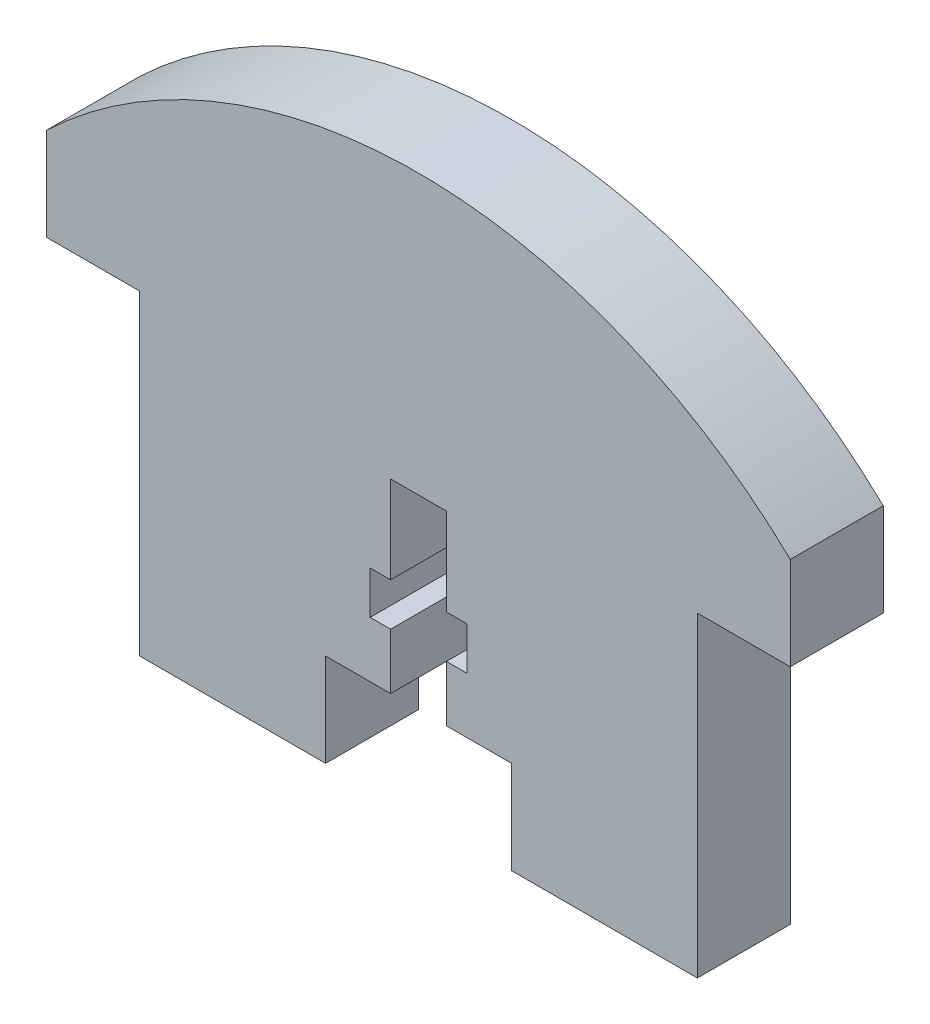
ISO-10303-21;
HEADER;
FILE_DESCRIPTION(('STEP AP214'),'2;1');
FILE_NAME('part.step','',(''),(''),'','','');
FILE_SCHEMA(('AUTOMOTIVE_DESIGN { 1 0 10303 214 1 1 1 1 }'));
ENDSEC;
DATA;
#1=APPLICATION_CONTEXT('core data for automotive mechanical design processes');
#2=APPLICATION_PROTOCOL_DEFINITION('international standard','automotive_design',2000,#1);
#3=PRODUCT_CONTEXT('',#1,'mechanical');
#4=PRODUCT('Part','Part','',(#3));
#5=PRODUCT_RELATED_PRODUCT_CATEGORY('part','',(#4));
#6=PRODUCT_DEFINITION_FORMATION('','',#4);
#7=PRODUCT_DEFINITION_CONTEXT('part definition',#1,'design');
#8=PRODUCT_DEFINITION('design','',#6,#7);
#9=PRODUCT_DEFINITION_SHAPE('','',#8);
#10=(LENGTH_UNIT() NAMED_UNIT(*) SI_UNIT(.MILLI.,.METRE.));
#11=(NAMED_UNIT(*) PLANE_ANGLE_UNIT() SI_UNIT($,.RADIAN.));
#12=(NAMED_UNIT(*) SI_UNIT($,.STERADIAN.) SOLID_ANGLE_UNIT());
#13=UNCERTAINTY_MEASURE_WITH_UNIT(LENGTH_MEASURE(1.E-05),#10,'distance_accuracy_value','');
#14=(GEOMETRIC_REPRESENTATION_CONTEXT(3) GLOBAL_UNCERTAINTY_ASSIGNED_CONTEXT((#13)) GLOBAL_UNIT_ASSIGNED_CONTEXT((#10,
#11,#12)) REPRESENTATION_CONTEXT('',''));
#15=CARTESIAN_POINT('',(0.,0.,0.));
#16=DIRECTION('',(0.,0.,1.));
#17=DIRECTION('',(1.,0.,0.));
#18=AXIS2_PLACEMENT_3D('',#15,#16,#17);
#19=CARTESIAN_POINT('',(-1.5,0.,5.));
#20=DIRECTION('',(1.,0.,0.));
#21=DIRECTION('',(0.,1.,0.));
#22=AXIS2_PLACEMENT_3D('',#19,#20,#21);
#23=PLANE('',#22);
#24=DIRECTION('',(0.,-1.,0.));
#25=VECTOR('',#24,1.);
#26=CARTESIAN_POINT('',(-1.5,0.,0.));
#27=LINE('',#26,#25);
#28=CARTESIAN_POINT('',(-1.5,3.00000000000001,0.));
#29=VERTEX_POINT('',#28);
#30=CARTESIAN_POINT('',(-1.5,0.,0.));
#31=VERTEX_POINT('',#30);
#32=EDGE_CURVE('E239',#29,#31,#27,.T.);
#33=ORIENTED_EDGE('',*,*,#32,.F.);
#34=DIRECTION('',(0.,0.,-1.));
#35=VECTOR('',#34,1.);
#36=CARTESIAN_POINT('',(-1.5,3.00000000000001,5.));
#37=LINE('',#36,#35);
#38=CARTESIAN_POINT('',(-1.5,3.00000000000001,5.));
#39=VERTEX_POINT('',#38);
#40=EDGE_CURVE('E11',#39,#29,#37,.T.);
#41=ORIENTED_EDGE('',*,*,#40,.F.);
#42=DIRECTION('',(0.,-1.,0.));
#43=VECTOR('',#42,1.);
#44=CARTESIAN_POINT('',(-1.5,0.,5.));
#45=LINE('',#44,#43);
#46=CARTESIAN_POINT('',(-1.5,0.,5.));
#47=VERTEX_POINT('',#46);
#48=EDGE_CURVE('E324',#39,#47,#45,.T.);
#49=ORIENTED_EDGE('',*,*,#48,.T.);
#50=DIRECTION('',(0.,0.,-1.));
#51=VECTOR('',#50,1.);
#52=CARTESIAN_POINT('',(-1.5,0.,5.));
#53=LINE('',#52,#51);
#54=EDGE_CURVE('E58',#47,#31,#53,.T.);
#55=ORIENTED_EDGE('',*,*,#54,.T.);
#56=EDGE_LOOP('',(#33,#41,#49,#55));
#57=FACE_BOUND('',#56,.T.);
#58=ADVANCED_FACE('F41',(#57),#23,.T.);
#59=CARTESIAN_POINT('',(0.,3.,5.));
#60=DIRECTION('',(0.,-1.,0.));
#61=DIRECTION('',(1.,0.,0.));
#62=AXIS2_PLACEMENT_3D('',#59,#60,#61);
#63=PLANE('',#62);
#64=DIRECTION('',(-1.,0.,0.));
#65=VECTOR('',#64,1.);
#66=CARTESIAN_POINT('',(0.,3.,0.));
#67=LINE('',#66,#65);
#68=CARTESIAN_POINT('',(-2.6,3.00000000000001,0.));
#69=VERTEX_POINT('',#68);
#70=EDGE_CURVE('E242',#29,#69,#67,.T.);
#71=ORIENTED_EDGE('',*,*,#70,.T.);
#72=DIRECTION('',(0.,0.,-1.));
#73=VECTOR('',#72,1.);
#74=CARTESIAN_POINT('',(-2.6,3.00000000000001,5.));
#75=LINE('',#74,#73);
#76=CARTESIAN_POINT('',(-2.6,3.00000000000001,5.));
#77=VERTEX_POINT('',#76);
#78=EDGE_CURVE('E50',#77,#69,#75,.T.);
#79=ORIENTED_EDGE('',*,*,#78,.F.);
#80=DIRECTION('',(-1.,0.,0.));
#81=VECTOR('',#80,1.);
#82=CARTESIAN_POINT('',(0.,3.,5.));
#83=LINE('',#82,#81);
#84=EDGE_CURVE('E419',#39,#77,#83,.T.);
#85=ORIENTED_EDGE('',*,*,#84,.F.);
#86=ORIENTED_EDGE('',*,*,#40,.T.);
#87=EDGE_LOOP('',(#71,#79,#85,#86));
#88=FACE_BOUND('',#87,.T.);
#89=ADVANCED_FACE('F494',(#88),#63,.F.);
#90=CARTESIAN_POINT('',(-2.6,0.,5.));
#91=DIRECTION('',(-1.,0.,0.));
#92=DIRECTION('',(0.,-1.,0.));
#93=AXIS2_PLACEMENT_3D('',#90,#91,#92);
#94=PLANE('',#93);
#95=DIRECTION('',(0.,1.,0.));
#96=VECTOR('',#95,1.);
#97=CARTESIAN_POINT('',(-2.6,0.,0.));
#98=LINE('',#97,#96);
#99=CARTESIAN_POINT('',(-2.6,5.3,0.));
#100=VERTEX_POINT('',#99);
#101=EDGE_CURVE('E245',#69,#100,#98,.T.);
#102=ORIENTED_EDGE('',*,*,#101,.T.);
#103=DIRECTION('',(0.,0.,-1.));
#104=VECTOR('',#103,1.);
#105=CARTESIAN_POINT('',(-2.6,5.3,5.));
#106=LINE('',#105,#104);
#107=CARTESIAN_POINT('',(-2.6,5.3,5.));
#108=VERTEX_POINT('',#107);
#109=EDGE_CURVE('E387',#108,#100,#106,.T.);
#110=ORIENTED_EDGE('',*,*,#109,.F.);
#111=DIRECTION('',(0.,1.,0.));
#112=VECTOR('',#111,1.);
#113=CARTESIAN_POINT('',(-2.6,0.,5.));
#114=LINE('',#113,#112);
#115=EDGE_CURVE('E398',#77,#108,#114,.T.);
#116=ORIENTED_EDGE('',*,*,#115,.F.);
#117=ORIENTED_EDGE('',*,*,#78,.T.);
#118=EDGE_LOOP('',(#102,#110,#116,#117));
#119=FACE_BOUND('',#118,.T.);
#120=ADVANCED_FACE('F396',(#119),#94,.F.);
#121=CARTESIAN_POINT('',(0.,5.29999999999999,5.));
#122=DIRECTION('',(0.,1.,0.));
#123=DIRECTION('',(-1.,0.,0.));
#124=AXIS2_PLACEMENT_3D('',#121,#122,#123);
#125=PLANE('',#124);
#126=DIRECTION('',(1.,0.,0.));
#127=VECTOR('',#126,1.);
#128=CARTESIAN_POINT('',(0.,5.29999999999999,0.));
#129=LINE('',#128,#127);
#130=CARTESIAN_POINT('',(-1.5,5.3,0.));
#131=VERTEX_POINT('',#130);
#132=EDGE_CURVE('E248',#100,#131,#129,.T.);
#133=ORIENTED_EDGE('',*,*,#132,.T.);
#134=DIRECTION('',(0.,0.,-1.));
#135=VECTOR('',#134,1.);
#136=CARTESIAN_POINT('',(-1.5,5.3,5.));
#137=LINE('',#136,#135);
#138=CARTESIAN_POINT('',(-1.5,5.3,5.));
#139=VERTEX_POINT('',#138);
#140=EDGE_CURVE('E384',#139,#131,#137,.T.);
#141=ORIENTED_EDGE('',*,*,#140,.F.);
#142=DIRECTION('',(1.,0.,0.));
#143=VECTOR('',#142,1.);
#144=CARTESIAN_POINT('',(0.,5.29999999999999,5.));
#145=LINE('',#144,#143);
#146=EDGE_CURVE('E410',#108,#139,#145,.T.);
#147=ORIENTED_EDGE('',*,*,#146,.F.);
#148=ORIENTED_EDGE('',*,*,#109,.T.);
#149=EDGE_LOOP('',(#133,#141,#147,#148));
#150=FACE_BOUND('',#149,.T.);
#151=ADVANCED_FACE('F407',(#150),#125,.F.);
#152=CARTESIAN_POINT('',(-1.5,0.,5.));
#153=DIRECTION('',(1.,0.,0.));
#154=DIRECTION('',(0.,1.,0.));
#155=AXIS2_PLACEMENT_3D('',#152,#153,#154);
#156=PLANE('',#155);
#157=DIRECTION('',(0.,-1.,0.));
#158=VECTOR('',#157,1.);
#159=CARTESIAN_POINT('',(-1.5,0.,0.));
#160=LINE('',#159,#158);
#161=CARTESIAN_POINT('',(-1.5,10.,0.));
#162=VERTEX_POINT('',#161);
#163=EDGE_CURVE('E252',#162,#131,#160,.T.);
#164=ORIENTED_EDGE('',*,*,#163,.F.);
#165=DIRECTION('',(0.,0.,-1.));
#166=VECTOR('',#165,1.);
#167=CARTESIAN_POINT('',(-1.5,10.,5.));
#168=LINE('',#167,#166);
#169=CARTESIAN_POINT('',(-1.5,10.,5.));
#170=VERTEX_POINT('',#169);
#171=EDGE_CURVE('E381',#170,#162,#168,.T.);
#172=ORIENTED_EDGE('',*,*,#171,.F.);
#173=DIRECTION('',(0.,-1.,0.));
#174=VECTOR('',#173,1.);
#175=CARTESIAN_POINT('',(-1.5,0.,5.));
#176=LINE('',#175,#174);
#177=EDGE_CURVE('E413',#170,#139,#176,.T.);
#178=ORIENTED_EDGE('',*,*,#177,.T.);
#179=ORIENTED_EDGE('',*,*,#140,.T.);
#180=EDGE_LOOP('',(#164,#172,#178,#179));
#181=FACE_BOUND('',#180,.T.);
#182=ADVANCED_FACE('F681',(#181),#156,.T.);
#183=CARTESIAN_POINT('',(0.,10.,5.));
#184=DIRECTION('',(0.,-1.,0.));
#185=DIRECTION('',(0.,0.,-1.));
#186=AXIS2_PLACEMENT_3D('',#183,#184,#185);
#187=PLANE('',#186);
#188=DIRECTION('',(-1.,0.,0.));
#189=VECTOR('',#188,1.);
#190=CARTESIAN_POINT('',(0.,10.,0.));
#191=LINE('',#190,#189);
#192=CARTESIAN_POINT('',(1.5,10.,0.));
#193=VERTEX_POINT('',#192);
#194=EDGE_CURVE('E256',#193,#162,#191,.T.);
#195=ORIENTED_EDGE('',*,*,#194,.F.);
#196=DIRECTION('',(0.,0.,-1.));
#197=VECTOR('',#196,1.);
#198=CARTESIAN_POINT('',(1.5,10.,5.));
#199=LINE('',#198,#197);
#200=CARTESIAN_POINT('',(1.5,10.,5.));
#201=VERTEX_POINT('',#200);
#202=EDGE_CURVE('E378',#201,#193,#199,.T.);
#203=ORIENTED_EDGE('',*,*,#202,.F.);
#204=DIRECTION('',(-1.,0.,0.));
#205=VECTOR('',#204,1.);
#206=CARTESIAN_POINT('',(0.,10.,5.));
#207=LINE('',#206,#205);
#208=EDGE_CURVE('E417',#201,#170,#207,.T.);
#209=ORIENTED_EDGE('',*,*,#208,.T.);
#210=ORIENTED_EDGE('',*,*,#171,.T.);
#211=EDGE_LOOP('',(#195,#203,#209,#210));
#212=FACE_BOUND('',#211,.T.);
#213=ADVANCED_FACE('F671',(#212),#187,.T.);
#214=CARTESIAN_POINT('',(1.5,0.,5.));
#215=DIRECTION('',(-1.,0.,0.));
#216=DIRECTION('',(0.,-1.,0.));
#217=AXIS2_PLACEMENT_3D('',#214,#215,#216);
#218=PLANE('',#217);
#219=DIRECTION('',(0.,1.,0.));
#220=VECTOR('',#219,1.);
#221=CARTESIAN_POINT('',(1.5,0.,0.));
#222=LINE('',#221,#220);
#223=CARTESIAN_POINT('',(1.5,5.3,0.));
#224=VERTEX_POINT('',#223);
#225=EDGE_CURVE('E260',#224,#193,#222,.T.);
#226=ORIENTED_EDGE('',*,*,#225,.F.);
#227=DIRECTION('',(0.,0.,-1.));
#228=VECTOR('',#227,1.);
#229=CARTESIAN_POINT('',(1.5,5.3,5.));
#230=LINE('',#229,#228);
#231=CARTESIAN_POINT('',(1.5,5.3,5.));
#232=VERTEX_POINT('',#231);
#233=EDGE_CURVE('E375',#232,#224,#230,.T.);
#234=ORIENTED_EDGE('',*,*,#233,.F.);
#235=DIRECTION('',(0.,1.,0.));
#236=VECTOR('',#235,1.);
#237=CARTESIAN_POINT('',(1.5,0.,5.));
#238=LINE('',#237,#236);
#239=EDGE_CURVE('E426',#232,#201,#238,.T.);
#240=ORIENTED_EDGE('',*,*,#239,.T.);
#241=ORIENTED_EDGE('',*,*,#202,.T.);
#242=EDGE_LOOP('',(#226,#234,#240,#241));
#243=FACE_BOUND('',#242,.T.);
#244=ADVANCED_FACE('F661',(#243),#218,.T.);
#245=CARTESIAN_POINT('',(0.,5.29999999999999,5.));
#246=DIRECTION('',(0.,1.,0.));
#247=DIRECTION('',(-1.,0.,0.));
#248=AXIS2_PLACEMENT_3D('',#245,#246,#247);
#249=PLANE('',#248);
#250=DIRECTION('',(1.,0.,0.));
#251=VECTOR('',#250,1.);
#252=CARTESIAN_POINT('',(0.,5.29999999999999,0.));
#253=LINE('',#252,#251);
#254=CARTESIAN_POINT('',(2.6,5.3,0.));
#255=VERTEX_POINT('',#254);
#256=EDGE_CURVE('E264',#224,#255,#253,.T.);
#257=ORIENTED_EDGE('',*,*,#256,.T.);
#258=DIRECTION('',(0.,0.,-1.));
#259=VECTOR('',#258,1.);
#260=CARTESIAN_POINT('',(2.6,5.3,5.));
#261=LINE('',#260,#259);
#262=CARTESIAN_POINT('',(2.6,5.3,5.));
#263=VERTEX_POINT('',#262);
#264=EDGE_CURVE('E371',#263,#255,#261,.T.);
#265=ORIENTED_EDGE('',*,*,#264,.F.);
#266=DIRECTION('',(1.,0.,0.));
#267=VECTOR('',#266,1.);
#268=CARTESIAN_POINT('',(0.,5.29999999999999,5.));
#269=LINE('',#268,#267);
#270=EDGE_CURVE('E430',#232,#263,#269,.T.);
#271=ORIENTED_EDGE('',*,*,#270,.F.);
#272=ORIENTED_EDGE('',*,*,#233,.T.);
#273=EDGE_LOOP('',(#257,#265,#271,#272));
#274=FACE_BOUND('',#273,.T.);
#275=ADVANCED_FACE('F651',(#274),#249,.F.);
#276=CARTESIAN_POINT('',(2.6,0.,5.));
#277=DIRECTION('',(1.,0.,0.));
#278=DIRECTION('',(0.,1.,0.));
#279=AXIS2_PLACEMENT_3D('',#276,#277,#278);
#280=PLANE('',#279);
#281=DIRECTION('',(0.,-1.,0.));
#282=VECTOR('',#281,1.);
#283=CARTESIAN_POINT('',(2.6,0.,0.));
#284=LINE('',#283,#282);
#285=CARTESIAN_POINT('',(2.6,3.00000000000001,0.));
#286=VERTEX_POINT('',#285);
#287=EDGE_CURVE('E267',#255,#286,#284,.T.);
#288=ORIENTED_EDGE('',*,*,#287,.T.);
#289=DIRECTION('',(0.,0.,-1.));
#290=VECTOR('',#289,1.);
#291=CARTESIAN_POINT('',(2.6,3.00000000000001,5.));
#292=LINE('',#291,#290);
#293=CARTESIAN_POINT('',(2.6,3.00000000000001,5.));
#294=VERTEX_POINT('',#293);
#295=EDGE_CURVE('E367',#294,#286,#292,.T.);
#296=ORIENTED_EDGE('',*,*,#295,.F.);
#297=DIRECTION('',(0.,-1.,0.));
#298=VECTOR('',#297,1.);
#299=CARTESIAN_POINT('',(2.6,0.,5.));
#300=LINE('',#299,#298);
#301=EDGE_CURVE('E433',#263,#294,#300,.T.);
#302=ORIENTED_EDGE('',*,*,#301,.F.);
#303=ORIENTED_EDGE('',*,*,#264,.T.);
#304=EDGE_LOOP('',(#288,#296,#302,#303));
#305=FACE_BOUND('',#304,.T.);
#306=ADVANCED_FACE('F641',(#305),#280,.F.);
#307=CARTESIAN_POINT('',(0.,3.00000000000001,5.));
#308=DIRECTION('',(0.,-1.,0.));
#309=DIRECTION('',(0.,0.,-1.));
#310=AXIS2_PLACEMENT_3D('',#307,#308,#309);
#311=PLANE('',#310);
#312=DIRECTION('',(-1.,0.,0.));
#313=VECTOR('',#312,1.);
#314=CARTESIAN_POINT('',(0.,3.00000000000001,0.));
#315=LINE('',#314,#313);
#316=CARTESIAN_POINT('',(1.5,3.00000000000001,0.));
#317=VERTEX_POINT('',#316);
#318=EDGE_CURVE('E270',#286,#317,#315,.T.);
#319=ORIENTED_EDGE('',*,*,#318,.T.);
#320=DIRECTION('',(0.,0.,-1.));
#321=VECTOR('',#320,1.);
#322=CARTESIAN_POINT('',(1.5,3.00000000000001,5.));
#323=LINE('',#322,#321);
#324=CARTESIAN_POINT('',(1.5,3.00000000000001,5.));
#325=VERTEX_POINT('',#324);
#326=EDGE_CURVE('E364',#325,#317,#323,.T.);
#327=ORIENTED_EDGE('',*,*,#326,.F.);
#328=DIRECTION('',(-1.,0.,0.));
#329=VECTOR('',#328,1.);
#330=CARTESIAN_POINT('',(0.,3.00000000000001,5.));
#331=LINE('',#330,#329);
#332=EDGE_CURVE('E436',#294,#325,#331,.T.);
#333=ORIENTED_EDGE('',*,*,#332,.F.);
#334=ORIENTED_EDGE('',*,*,#295,.T.);
#335=EDGE_LOOP('',(#319,#327,#333,#334));
#336=FACE_BOUND('',#335,.T.);
#337=ADVANCED_FACE('F631',(#336),#311,.F.);
#338=CARTESIAN_POINT('',(1.5,0.,5.));
#339=DIRECTION('',(-1.,0.,0.));
#340=DIRECTION('',(0.,0.,1.));
#341=AXIS2_PLACEMENT_3D('',#338,#339,#340);
#342=PLANE('',#341);
#343=DIRECTION('',(0.,1.,0.));
#344=VECTOR('',#343,1.);
#345=CARTESIAN_POINT('',(1.5,0.,0.));
#346=LINE('',#345,#344);
#347=CARTESIAN_POINT('',(1.5,0.,0.));
#348=VERTEX_POINT('',#347);
#349=EDGE_CURVE('E274',#348,#317,#346,.T.);
#350=ORIENTED_EDGE('',*,*,#349,.F.);
#351=DIRECTION('',(0.,0.,-1.));
#352=VECTOR('',#351,1.);
#353=CARTESIAN_POINT('',(1.5,0.,5.));
#354=LINE('',#353,#352);
#355=CARTESIAN_POINT('',(1.5,0.,5.));
#356=VERTEX_POINT('',#355);
#357=EDGE_CURVE('E361',#356,#348,#354,.T.);
#358=ORIENTED_EDGE('',*,*,#357,.F.);
#359=DIRECTION('',(0.,1.,0.));
#360=VECTOR('',#359,1.);
#361=CARTESIAN_POINT('',(1.5,0.,5.));
#362=LINE('',#361,#360);
#363=EDGE_CURVE('E439',#356,#325,#362,.T.);
#364=ORIENTED_EDGE('',*,*,#363,.T.);
#365=ORIENTED_EDGE('',*,*,#326,.T.);
#366=EDGE_LOOP('',(#350,#358,#364,#365));
#367=FACE_BOUND('',#366,.T.);
#368=ADVANCED_FACE('F621',(#367),#342,.T.);
#369=CARTESIAN_POINT('',(0.,0.,5.));
#370=DIRECTION('',(0.,1.,0.));
#371=DIRECTION('',(-1.,0.,0.));
#372=AXIS2_PLACEMENT_3D('',#369,#370,#371);
#373=PLANE('',#372);
#374=DIRECTION('',(1.,0.,0.));
#375=VECTOR('',#374,1.);
#376=CARTESIAN_POINT('',(0.,0.,0.));
#377=LINE('',#376,#375);
#378=CARTESIAN_POINT('',(5.,0.,0.));
#379=VERTEX_POINT('',#378);
#380=EDGE_CURVE('E278',#348,#379,#377,.T.);
#381=ORIENTED_EDGE('',*,*,#380,.T.);
#382=DIRECTION('',(0.,0.,-1.));
#383=VECTOR('',#382,1.);
#384=CARTESIAN_POINT('',(5.,0.,5.));
#385=LINE('',#384,#383);
#386=CARTESIAN_POINT('',(5.,0.,5.));
#387=VERTEX_POINT('',#386);
#388=EDGE_CURVE('E357',#387,#379,#385,.T.);
#389=ORIENTED_EDGE('',*,*,#388,.F.);
#390=DIRECTION('',(1.,0.,0.));
#391=VECTOR('',#390,1.);
#392=CARTESIAN_POINT('',(0.,0.,5.));
#393=LINE('',#392,#391);
#394=EDGE_CURVE('E443',#356,#387,#393,.T.);
#395=ORIENTED_EDGE('',*,*,#394,.F.);
#396=ORIENTED_EDGE('',*,*,#357,.T.);
#397=EDGE_LOOP('',(#381,#389,#395,#396));
#398=FACE_BOUND('',#397,.T.);
#399=ADVANCED_FACE('F611',(#398),#373,.F.);
#400=CARTESIAN_POINT('',(5.,0.,5.));
#401=DIRECTION('',(1.,0.,0.));
#402=DIRECTION('',(0.,1.,0.));
#403=AXIS2_PLACEMENT_3D('',#400,#401,#402);
#404=PLANE('',#403);
#405=DIRECTION('',(0.,-1.,0.));
#406=VECTOR('',#405,1.);
#407=CARTESIAN_POINT('',(5.,0.,0.));
#408=LINE('',#407,#406);
#409=CARTESIAN_POINT('',(5.,-5.,0.));
#410=VERTEX_POINT('',#409);
#411=EDGE_CURVE('E281',#379,#410,#408,.T.);
#412=ORIENTED_EDGE('',*,*,#411,.T.);
#413=DIRECTION('',(0.,0.,-1.));
#414=VECTOR('',#413,1.);
#415=CARTESIAN_POINT('',(5.,-5.,5.));
#416=LINE('',#415,#414);
#417=CARTESIAN_POINT('',(5.,-5.,5.));
#418=VERTEX_POINT('',#417);
#419=EDGE_CURVE('E353',#418,#410,#416,.T.);
#420=ORIENTED_EDGE('',*,*,#419,.F.);
#421=DIRECTION('',(0.,-1.,0.));
#422=VECTOR('',#421,1.);
#423=CARTESIAN_POINT('',(5.,0.,5.));
#424=LINE('',#423,#422);
#425=EDGE_CURVE('E446',#387,#418,#424,.T.);
#426=ORIENTED_EDGE('',*,*,#425,.F.);
#427=ORIENTED_EDGE('',*,*,#388,.T.);
#428=EDGE_LOOP('',(#412,#420,#426,#427));
#429=FACE_BOUND('',#428,.T.);
#430=ADVANCED_FACE('F601',(#429),#404,.F.);
#431=CARTESIAN_POINT('',(0.,-5.,5.));
#432=DIRECTION('',(0.,1.,0.));
#433=DIRECTION('',(-1.,0.,0.));
#434=AXIS2_PLACEMENT_3D('',#431,#432,#433);
#435=PLANE('',#434);
#436=DIRECTION('',(1.,0.,0.));
#437=VECTOR('',#436,1.);
#438=CARTESIAN_POINT('',(0.,-5.,0.));
#439=LINE('',#438,#437);
#440=CARTESIAN_POINT('',(15.,-5.,0.));
#441=VERTEX_POINT('',#440);
#442=EDGE_CURVE('E284',#410,#441,#439,.T.);
#443=ORIENTED_EDGE('',*,*,#442,.T.);
#444=DIRECTION('',(0.,0.,-1.));
#445=VECTOR('',#444,1.);
#446=CARTESIAN_POINT('',(15.,-5.,5.));
#447=LINE('',#446,#445);
#448=CARTESIAN_POINT('',(15.,-5.,5.));
#449=VERTEX_POINT('',#448);
#450=EDGE_CURVE('E349',#449,#441,#447,.T.);
#451=ORIENTED_EDGE('',*,*,#450,.F.);
#452=DIRECTION('',(1.,0.,0.));
#453=VECTOR('',#452,1.);
#454=CARTESIAN_POINT('',(0.,-5.,5.));
#455=LINE('',#454,#453);
#456=EDGE_CURVE('E449',#418,#449,#455,.T.);
#457=ORIENTED_EDGE('',*,*,#456,.F.);
#458=ORIENTED_EDGE('',*,*,#419,.T.);
#459=EDGE_LOOP('',(#443,#451,#457,#458));
#460=FACE_BOUND('',#459,.T.);
#461=ADVANCED_FACE('F590',(#460),#435,.F.);
#462=CARTESIAN_POINT('',(15.,0.,5.));
#463=DIRECTION('',(-1.,0.,0.));
#464=DIRECTION('',(0.,-1.,0.));
#465=AXIS2_PLACEMENT_3D('',#462,#463,#464);
#466=PLANE('',#465);
#467=DIRECTION('',(0.,1.,0.));
#468=VECTOR('',#467,1.);
#469=CARTESIAN_POINT('',(15.,0.,0.));
#470=LINE('',#469,#468);
#471=CARTESIAN_POINT('',(15.,12.,0.));
#472=VERTEX_POINT('',#471);
#473=EDGE_CURVE('E287',#441,#472,#470,.T.);
#474=ORIENTED_EDGE('',*,*,#473,.T.);
#475=DIRECTION('',(0.,0.,-1.));
#476=VECTOR('',#475,1.);
#477=CARTESIAN_POINT('',(15.,12.,5.));
#478=LINE('',#477,#476);
#479=CARTESIAN_POINT('',(15.,12.,5.));
#480=VERTEX_POINT('',#479);
#481=EDGE_CURVE('E346',#480,#472,#478,.T.);
#482=ORIENTED_EDGE('',*,*,#481,.F.);
#483=DIRECTION('',(0.,1.,0.));
#484=VECTOR('',#483,1.);
#485=CARTESIAN_POINT('',(15.,0.,5.));
#486=LINE('',#485,#484);
#487=EDGE_CURVE('E452',#449,#480,#486,.T.);
#488=ORIENTED_EDGE('',*,*,#487,.F.);
#489=ORIENTED_EDGE('',*,*,#450,.T.);
#490=EDGE_LOOP('',(#474,#482,#488,#489));
#491=FACE_BOUND('',#490,.T.);
#492=ADVANCED_FACE('F580',(#491),#466,.F.);
#493=CARTESIAN_POINT('',(0.,12.,5.));
#494=DIRECTION('',(0.,-1.,0.));
#495=DIRECTION('',(1.,0.,0.));
#496=AXIS2_PLACEMENT_3D('',#493,#494,#495);
#497=PLANE('',#496);
#498=DIRECTION('',(-1.,0.,0.));
#499=VECTOR('',#498,1.);
#500=CARTESIAN_POINT('',(0.,12.,0.));
#501=LINE('',#500,#499);
#502=CARTESIAN_POINT('',(20.,12.,0.));
#503=VERTEX_POINT('',#502);
#504=EDGE_CURVE('E291',#503,#472,#501,.T.);
#505=ORIENTED_EDGE('',*,*,#504,.F.);
#506=DIRECTION('',(0.,0.,-1.));
#507=VECTOR('',#506,1.);
#508=CARTESIAN_POINT('',(20.,12.,5.));
#509=LINE('',#508,#507);
#510=CARTESIAN_POINT('',(20.,12.,5.));
#511=VERTEX_POINT('',#510);
#512=EDGE_CURVE('E343',#511,#503,#509,.T.);
#513=ORIENTED_EDGE('',*,*,#512,.F.);
#514=DIRECTION('',(-1.,0.,0.));
#515=VECTOR('',#514,1.);
#516=CARTESIAN_POINT('',(0.,12.,5.));
#517=LINE('',#516,#515);
#518=EDGE_CURVE('E455',#511,#480,#517,.T.);
#519=ORIENTED_EDGE('',*,*,#518,.T.);
#520=ORIENTED_EDGE('',*,*,#481,.T.);
#521=EDGE_LOOP('',(#505,#513,#519,#520));
#522=FACE_BOUND('',#521,.T.);
#523=ADVANCED_FACE('F570',(#522),#497,.T.);
#524=CARTESIAN_POINT('',(20.,0.,5.));
#525=DIRECTION('',(1.,0.,0.));
#526=DIRECTION('',(0.,1.,0.));
#527=AXIS2_PLACEMENT_3D('',#524,#525,#526);
#528=PLANE('',#527);
#529=DIRECTION('',(0.,-1.,0.));
#530=VECTOR('',#529,1.);
#531=CARTESIAN_POINT('',(20.,0.,0.));
#532=LINE('',#531,#530);
#533=CARTESIAN_POINT('',(20.,17.,0.));
#534=VERTEX_POINT('',#533);
#535=EDGE_CURVE('E295',#534,#503,#532,.T.);
#536=ORIENTED_EDGE('',*,*,#535,.F.);
#537=DIRECTION('',(0.,0.,-1.));
#538=VECTOR('',#537,1.);
#539=CARTESIAN_POINT('',(20.,17.,5.));
#540=LINE('',#539,#538);
#541=CARTESIAN_POINT('',(20.,17.,5.));
#542=VERTEX_POINT('',#541);
#543=EDGE_CURVE('E340',#542,#534,#540,.T.);
#544=ORIENTED_EDGE('',*,*,#543,.F.);
#545=DIRECTION('',(0.,-1.,0.));
#546=VECTOR('',#545,1.);
#547=CARTESIAN_POINT('',(20.,0.,5.));
#548=LINE('',#547,#546);
#549=EDGE_CURVE('E459',#542,#511,#548,.T.);
#550=ORIENTED_EDGE('',*,*,#549,.T.);
#551=ORIENTED_EDGE('',*,*,#512,.T.);
#552=EDGE_LOOP('',(#536,#544,#550,#551));
#553=FACE_BOUND('',#552,.T.);
#554=ADVANCED_FACE('F560',(#553),#528,.T.);
#555=CARTESIAN_POINT('',(0.,-4.00000000000004,5.));
#556=DIRECTION('',(0.,0.,-1.));
#557=DIRECTION('',(-1.,0.,0.));
#558=AXIS2_PLACEMENT_3D('',#555,#556,#557);
#559=CYLINDRICAL_SURFACE('',#558,29.);
#560=CARTESIAN_POINT('',(0.,-4.00000000000004,0.));
#561=DIRECTION('',(0.,0.,1.));
#562=DIRECTION('',(1.,0.,0.));
#563=AXIS2_PLACEMENT_3D('',#560,#561,#562);
#564=CIRCLE('',#563,29.);
#565=CARTESIAN_POINT('',(-20.,17.,0.));
#566=VERTEX_POINT('',#565);
#567=EDGE_CURVE('E299',#566,#534,#564,.F.);
#568=ORIENTED_EDGE('',*,*,#567,.F.);
#569=DIRECTION('',(0.,0.,-1.));
#570=VECTOR('',#569,1.);
#571=CARTESIAN_POINT('',(-20.,17.,5.));
#572=LINE('',#571,#570);
#573=CARTESIAN_POINT('',(-20.,17.,5.));
#574=VERTEX_POINT('',#573);
#575=EDGE_CURVE('E337',#574,#566,#572,.T.);
#576=ORIENTED_EDGE('',*,*,#575,.F.);
#577=CARTESIAN_POINT('',(0.,-4.00000000000004,5.));
#578=DIRECTION('',(0.,0.,1.));
#579=DIRECTION('',(1.,0.,0.));
#580=AXIS2_PLACEMENT_3D('',#577,#578,#579);
#581=CIRCLE('',#580,29.);
#582=EDGE_CURVE('E463',#574,#542,#581,.F.);
#583=ORIENTED_EDGE('',*,*,#582,.T.);
#584=ORIENTED_EDGE('',*,*,#543,.T.);
#585=EDGE_LOOP('',(#568,#576,#583,#584));
#586=FACE_BOUND('',#585,.T.);
#587=ADVANCED_FACE('F551',(#586),#559,.T.);
#588=CARTESIAN_POINT('',(-20.,0.,5.));
#589=DIRECTION('',(-1.,0.,0.));
#590=DIRECTION('',(0.,-1.,0.));
#591=AXIS2_PLACEMENT_3D('',#588,#589,#590);
#592=PLANE('',#591);
#593=DIRECTION('',(0.,1.,0.));
#594=VECTOR('',#593,1.);
#595=CARTESIAN_POINT('',(-20.,0.,0.));
#596=LINE('',#595,#594);
#597=CARTESIAN_POINT('',(-20.,12.,0.));
#598=VERTEX_POINT('',#597);
#599=EDGE_CURVE('E303',#598,#566,#596,.T.);
#600=ORIENTED_EDGE('',*,*,#599,.F.);
#601=DIRECTION('',(0.,0.,-1.));
#602=VECTOR('',#601,1.);
#603=CARTESIAN_POINT('',(-20.,12.,5.));
#604=LINE('',#603,#602);
#605=CARTESIAN_POINT('',(-20.,12.,5.));
#606=VERTEX_POINT('',#605);
#607=EDGE_CURVE('E334',#606,#598,#604,.T.);
#608=ORIENTED_EDGE('',*,*,#607,.F.);
#609=DIRECTION('',(0.,1.,0.));
#610=VECTOR('',#609,1.);
#611=CARTESIAN_POINT('',(-20.,0.,5.));
#612=LINE('',#611,#610);
#613=EDGE_CURVE('E467',#606,#574,#612,.T.);
#614=ORIENTED_EDGE('',*,*,#613,.T.);
#615=ORIENTED_EDGE('',*,*,#575,.T.);
#616=EDGE_LOOP('',(#600,#608,#614,#615));
#617=FACE_BOUND('',#616,.T.);
#618=ADVANCED_FACE('F480',(#617),#592,.T.);
#619=CARTESIAN_POINT('',(0.,12.,5.));
#620=DIRECTION('',(0.,-1.,0.));
#621=DIRECTION('',(0.,0.,-1.));
#622=AXIS2_PLACEMENT_3D('',#619,#620,#621);
#623=PLANE('',#622);
#624=DIRECTION('',(-1.,0.,0.));
#625=VECTOR('',#624,1.);
#626=CARTESIAN_POINT('',(0.,12.,0.));
#627=LINE('',#626,#625);
#628=CARTESIAN_POINT('',(-15.,12.,0.));
#629=VERTEX_POINT('',#628);
#630=EDGE_CURVE('E307',#629,#598,#627,.T.);
#631=ORIENTED_EDGE('',*,*,#630,.F.);
#632=DIRECTION('',(0.,0.,-1.));
#633=VECTOR('',#632,1.);
#634=CARTESIAN_POINT('',(-15.,12.,5.));
#635=LINE('',#634,#633);
#636=CARTESIAN_POINT('',(-15.,12.,5.));
#637=VERTEX_POINT('',#636);
#638=EDGE_CURVE('E331',#637,#629,#635,.T.);
#639=ORIENTED_EDGE('',*,*,#638,.F.);
#640=DIRECTION('',(-1.,0.,0.));
#641=VECTOR('',#640,1.);
#642=CARTESIAN_POINT('',(0.,12.,5.));
#643=LINE('',#642,#641);
#644=EDGE_CURVE('E233',#637,#606,#643,.T.);
#645=ORIENTED_EDGE('',*,*,#644,.T.);
#646=ORIENTED_EDGE('',*,*,#607,.T.);
#647=EDGE_LOOP('',(#631,#639,#645,#646));
#648=FACE_BOUND('',#647,.T.);
#649=ADVANCED_FACE('F474',(#648),#623,.T.);
#650=CARTESIAN_POINT('',(-15.,0.,5.));
#651=DIRECTION('',(1.,0.,0.));
#652=DIRECTION('',(0.,1.,0.));
#653=AXIS2_PLACEMENT_3D('',#650,#651,#652);
#654=PLANE('',#653);
#655=DIRECTION('',(0.,-1.,0.));
#656=VECTOR('',#655,1.);
#657=CARTESIAN_POINT('',(-15.,0.,0.));
#658=LINE('',#657,#656);
#659=CARTESIAN_POINT('',(-15.,-5.,0.));
#660=VERTEX_POINT('',#659);
#661=EDGE_CURVE('E311',#629,#660,#658,.T.);
#662=ORIENTED_EDGE('',*,*,#661,.T.);
#663=DIRECTION('',(0.,0.,-1.));
#664=VECTOR('',#663,1.);
#665=CARTESIAN_POINT('',(-15.,-5.,5.));
#666=LINE('',#665,#664);
#667=CARTESIAN_POINT('',(-15.,-5.,5.));
#668=VERTEX_POINT('',#667);
#669=EDGE_CURVE('E215',#668,#660,#666,.T.);
#670=ORIENTED_EDGE('',*,*,#669,.F.);
#671=DIRECTION('',(0.,-1.,0.));
#672=VECTOR('',#671,1.);
#673=CARTESIAN_POINT('',(-15.,0.,5.));
#674=LINE('',#673,#672);
#675=EDGE_CURVE('E228',#637,#668,#674,.T.);
#676=ORIENTED_EDGE('',*,*,#675,.F.);
#677=ORIENTED_EDGE('',*,*,#638,.T.);
#678=EDGE_LOOP('',(#662,#670,#676,#677));
#679=FACE_BOUND('',#678,.T.);
#680=ADVANCED_FACE('F484',(#679),#654,.F.);
#681=CARTESIAN_POINT('',(0.,-5.,5.));
#682=DIRECTION('',(0.,-1.,0.));
#683=DIRECTION('',(1.,0.,0.));
#684=AXIS2_PLACEMENT_3D('',#681,#682,#683);
#685=PLANE('',#684);
#686=DIRECTION('',(-1.,0.,0.));
#687=VECTOR('',#686,1.);
#688=CARTESIAN_POINT('',(0.,-5.,0.));
#689=LINE('',#688,#687);
#690=CARTESIAN_POINT('',(-5.,-5.,0.));
#691=VERTEX_POINT('',#690);
#692=EDGE_CURVE('E211',#691,#660,#689,.T.);
#693=ORIENTED_EDGE('',*,*,#692,.F.);
#694=DIRECTION('',(0.,0.,-1.));
#695=VECTOR('',#694,1.);
#696=CARTESIAN_POINT('',(-5.,-5.,5.));
#697=LINE('',#696,#695);
#698=CARTESIAN_POINT('',(-5.,-5.,5.));
#699=VERTEX_POINT('',#698);
#700=EDGE_CURVE('E205',#699,#691,#697,.T.);
#701=ORIENTED_EDGE('',*,*,#700,.F.);
#702=DIRECTION('',(-1.,0.,0.));
#703=VECTOR('',#702,1.);
#704=CARTESIAN_POINT('',(0.,-5.,5.));
#705=LINE('',#704,#703);
#706=EDGE_CURVE('E209',#699,#668,#705,.T.);
#707=ORIENTED_EDGE('',*,*,#706,.T.);
#708=ORIENTED_EDGE('',*,*,#669,.T.);
#709=EDGE_LOOP('',(#693,#701,#707,#708));
#710=FACE_BOUND('',#709,.T.);
#711=ADVANCED_FACE('F207',(#710),#685,.T.);
#712=CARTESIAN_POINT('',(-5.,0.,5.));
#713=DIRECTION('',(-1.,0.,0.));
#714=DIRECTION('',(0.,-1.,0.));
#715=AXIS2_PLACEMENT_3D('',#712,#713,#714);
#716=PLANE('',#715);
#717=DIRECTION('',(0.,1.,0.));
#718=VECTOR('',#717,1.);
#719=CARTESIAN_POINT('',(-5.,0.,0.));
#720=LINE('',#719,#718);
#721=CARTESIAN_POINT('',(-5.,0.,0.));
#722=VERTEX_POINT('',#721);
#723=EDGE_CURVE('E317',#691,#722,#720,.T.);
#724=ORIENTED_EDGE('',*,*,#723,.T.);
#725=DIRECTION('',(0.,0.,-1.));
#726=VECTOR('',#725,1.);
#727=CARTESIAN_POINT('',(-5.,0.,5.));
#728=LINE('',#727,#726);
#729=CARTESIAN_POINT('',(-5.,0.,5.));
#730=VERTEX_POINT('',#729);
#731=EDGE_CURVE('E132',#730,#722,#728,.T.);
#732=ORIENTED_EDGE('',*,*,#731,.F.);
#733=DIRECTION('',(0.,1.,0.));
#734=VECTOR('',#733,1.);
#735=CARTESIAN_POINT('',(-5.,0.,5.));
#736=LINE('',#735,#734);
#737=EDGE_CURVE('E217',#699,#730,#736,.T.);
#738=ORIENTED_EDGE('',*,*,#737,.F.);
#739=ORIENTED_EDGE('',*,*,#700,.T.);
#740=EDGE_LOOP('',(#724,#732,#738,#739));
#741=FACE_BOUND('',#740,.T.);
#742=ADVANCED_FACE('F218',(#741),#716,.F.);
#743=CARTESIAN_POINT('',(0.,0.,5.));
#744=DIRECTION('',(0.,-1.,0.));
#745=DIRECTION('',(1.,0.,0.));
#746=AXIS2_PLACEMENT_3D('',#743,#744,#745);
#747=PLANE('',#746);
#748=DIRECTION('',(-1.,0.,0.));
#749=VECTOR('',#748,1.);
#750=CARTESIAN_POINT('',(0.,0.,0.));
#751=LINE('',#750,#749);
#752=EDGE_CURVE('E320',#31,#722,#751,.T.);
#753=ORIENTED_EDGE('',*,*,#752,.F.);
#754=ORIENTED_EDGE('',*,*,#54,.F.);
#755=DIRECTION('',(-1.,0.,0.));
#756=VECTOR('',#755,1.);
#757=CARTESIAN_POINT('',(0.,0.,5.));
#758=LINE('',#757,#756);
#759=EDGE_CURVE('E222',#47,#730,#758,.T.);
#760=ORIENTED_EDGE('',*,*,#759,.T.);
#761=ORIENTED_EDGE('',*,*,#731,.T.);
#762=EDGE_LOOP('',(#753,#754,#760,#761));
#763=FACE_BOUND('',#762,.T.);
#764=ADVANCED_FACE('F498',(#763),#747,.T.);
#765=CARTESIAN_POINT('',(0.,0.,5.));
#766=DIRECTION('',(0.,0.,1.));
#767=DIRECTION('',(1.,0.,0.));
#768=AXIS2_PLACEMENT_3D('',#765,#766,#767);
#769=PLANE('',#768);
#770=ORIENTED_EDGE('',*,*,#48,.F.);
#771=ORIENTED_EDGE('',*,*,#84,.T.);
#772=ORIENTED_EDGE('',*,*,#115,.T.);
#773=ORIENTED_EDGE('',*,*,#146,.T.);
#774=ORIENTED_EDGE('',*,*,#177,.F.);
#775=ORIENTED_EDGE('',*,*,#208,.F.);
#776=ORIENTED_EDGE('',*,*,#239,.F.);
#777=ORIENTED_EDGE('',*,*,#270,.T.);
#778=ORIENTED_EDGE('',*,*,#301,.T.);
#779=ORIENTED_EDGE('',*,*,#332,.T.);
#780=ORIENTED_EDGE('',*,*,#363,.F.);
#781=ORIENTED_EDGE('',*,*,#394,.T.);
#782=ORIENTED_EDGE('',*,*,#425,.T.);
#783=ORIENTED_EDGE('',*,*,#456,.T.);
#784=ORIENTED_EDGE('',*,*,#487,.T.);
#785=ORIENTED_EDGE('',*,*,#518,.F.);
#786=ORIENTED_EDGE('',*,*,#549,.F.);
#787=ORIENTED_EDGE('',*,*,#582,.F.);
#788=ORIENTED_EDGE('',*,*,#613,.F.);
#789=ORIENTED_EDGE('',*,*,#644,.F.);
#790=ORIENTED_EDGE('',*,*,#675,.T.);
#791=ORIENTED_EDGE('',*,*,#706,.F.);
#792=ORIENTED_EDGE('',*,*,#737,.T.);
#793=ORIENTED_EDGE('',*,*,#759,.F.);
#794=EDGE_LOOP('',(#770,#771,#772,#773,#774,#775,#776,#777,#778,#779,#780,#781,#782,#783,#784,
#785,#786,#787,#788,#789,#790,#791,#792,#793));
#795=FACE_BOUND('',#794,.T.);
#796=ADVANCED_FACE('F225',(#795),#769,.T.);
#797=CARTESIAN_POINT('',(0.,0.,0.));
#798=DIRECTION('',(0.,0.,1.));
#799=DIRECTION('',(1.,0.,0.));
#800=AXIS2_PLACEMENT_3D('',#797,#798,#799);
#801=PLANE('',#800);
#802=ORIENTED_EDGE('',*,*,#32,.T.);
#803=ORIENTED_EDGE('',*,*,#752,.T.);
#804=ORIENTED_EDGE('',*,*,#723,.F.);
#805=ORIENTED_EDGE('',*,*,#692,.T.);
#806=ORIENTED_EDGE('',*,*,#661,.F.);
#807=ORIENTED_EDGE('',*,*,#630,.T.);
#808=ORIENTED_EDGE('',*,*,#599,.T.);
#809=ORIENTED_EDGE('',*,*,#567,.T.);
#810=ORIENTED_EDGE('',*,*,#535,.T.);
#811=ORIENTED_EDGE('',*,*,#504,.T.);
#812=ORIENTED_EDGE('',*,*,#473,.F.);
#813=ORIENTED_EDGE('',*,*,#442,.F.);
#814=ORIENTED_EDGE('',*,*,#411,.F.);
#815=ORIENTED_EDGE('',*,*,#380,.F.);
#816=ORIENTED_EDGE('',*,*,#349,.T.);
#817=ORIENTED_EDGE('',*,*,#318,.F.);
#818=ORIENTED_EDGE('',*,*,#287,.F.);
#819=ORIENTED_EDGE('',*,*,#256,.F.);
#820=ORIENTED_EDGE('',*,*,#225,.T.);
#821=ORIENTED_EDGE('',*,*,#194,.T.);
#822=ORIENTED_EDGE('',*,*,#163,.T.);
#823=ORIENTED_EDGE('',*,*,#132,.F.);
#824=ORIENTED_EDGE('',*,*,#101,.F.);
#825=ORIENTED_EDGE('',*,*,#70,.F.);
#826=EDGE_LOOP('',(#802,#803,#804,#805,#806,#807,#808,#809,#810,#811,#812,#813,#814,#815,#816,
#817,#818,#819,#820,#821,#822,#823,#824,#825));
#827=FACE_BOUND('',#826,.T.);
#828=ADVANCED_FACE('F403',(#827),#801,.F.);
#829=CLOSED_SHELL('',(#58,#89,#120,#151,#182,#213,#244,#275,#306,#337,#368,#399,#430,#461,#492,
#523,#554,#587,#618,#649,#680,#711,#742,#764,#796,#828));
#830=MANIFOLD_SOLID_BREP('B2',#829);
#831=ADVANCED_BREP_SHAPE_REPRESENTATION('',(#18,#830),#14);
#832=SHAPE_DEFINITION_REPRESENTATION(#9,#831);
ENDSEC;
END-ISO-10303-21;
